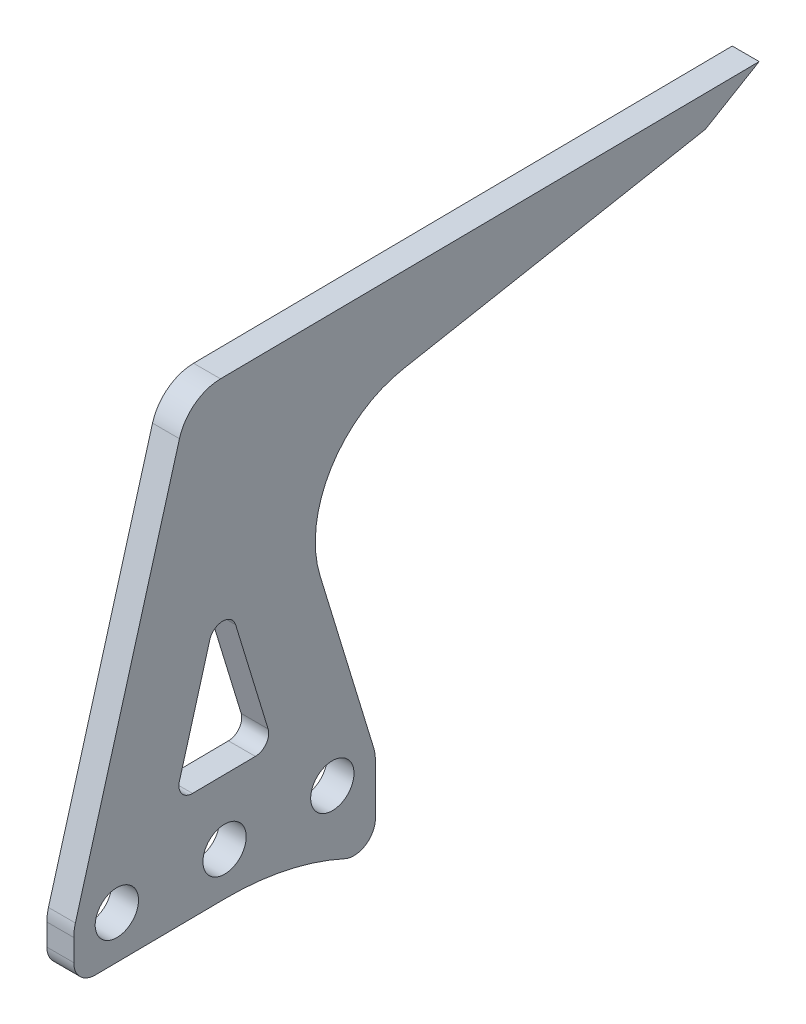
ISO-10303-21;
HEADER;
FILE_DESCRIPTION(('STEP AP214'),'2;1');
FILE_NAME('part.step','',(''),(''),'','','');
FILE_SCHEMA(('AUTOMOTIVE_DESIGN { 1 0 10303 214 1 1 1 1 }'));
ENDSEC;
DATA;
#1=APPLICATION_CONTEXT('core data for automotive mechanical design processes');
#2=APPLICATION_PROTOCOL_DEFINITION('international standard','automotive_design',2000,#1);
#3=PRODUCT_CONTEXT('',#1,'mechanical');
#4=PRODUCT('Part','Part','',(#3));
#5=PRODUCT_RELATED_PRODUCT_CATEGORY('part','',(#4));
#6=PRODUCT_DEFINITION_FORMATION('','',#4);
#7=PRODUCT_DEFINITION_CONTEXT('part definition',#1,'design');
#8=PRODUCT_DEFINITION('design','',#6,#7);
#9=PRODUCT_DEFINITION_SHAPE('','',#8);
#10=(LENGTH_UNIT() NAMED_UNIT(*) SI_UNIT(.MILLI.,.METRE.));
#11=(NAMED_UNIT(*) PLANE_ANGLE_UNIT() SI_UNIT($,.RADIAN.));
#12=(NAMED_UNIT(*) SI_UNIT($,.STERADIAN.) SOLID_ANGLE_UNIT());
#13=UNCERTAINTY_MEASURE_WITH_UNIT(LENGTH_MEASURE(1.E-05),#10,'distance_accuracy_value','');
#14=(GEOMETRIC_REPRESENTATION_CONTEXT(3) GLOBAL_UNCERTAINTY_ASSIGNED_CONTEXT((#13)) GLOBAL_UNIT_ASSIGNED_CONTEXT((#10,
#11,#12)) REPRESENTATION_CONTEXT('',''));
#15=CARTESIAN_POINT('',(0.,0.,0.));
#16=DIRECTION('',(0.,0.,1.));
#17=DIRECTION('',(1.,0.,0.));
#18=AXIS2_PLACEMENT_3D('',#15,#16,#17);
#19=CARTESIAN_POINT('',(0.431800000000018,0.,-221.533693244064));
#20=DIRECTION('',(1.,0.,0.));
#21=DIRECTION('',(0.,0.,-1.));
#22=AXIS2_PLACEMENT_3D('',#19,#20,#21);
#23=PLANE('',#22);
#24=CARTESIAN_POINT('',(0.431800000000018,0.,-221.533693244064));
#25=DIRECTION('',(-1.,0.,0.));
#26=DIRECTION('',(0.,0.,-1.));
#27=AXIS2_PLACEMENT_3D('',#24,#25,#26);
#28=CIRCLE('',#27,33.3375);
#29=CARTESIAN_POINT('',(0.431800000000018,33.3358222860145,-221.199240309772));
#30=VERTEX_POINT('',#29);
#31=CARTESIAN_POINT('',(0.431800000000018,30.3458070254473,-235.336624172831));
#32=VERTEX_POINT('',#31);
#33=EDGE_CURVE('E245',#30,#32,#28,.T.);
#34=ORIENTED_EDGE('',*,*,#33,.T.);
#35=CARTESIAN_POINT('',(0.431800000000018,32.6578685131004,-236.388276053118));
#36=DIRECTION('',(1.,0.,0.));
#37=DIRECTION('',(0.,0.,-1.));
#38=AXIS2_PLACEMENT_3D('',#35,#36,#37);
#39=CIRCLE('',#38,2.54);
#40=CARTESIAN_POINT('',(0.431800000000018,32.6578685131004,-238.928276053118));
#41=VERTEX_POINT('',#40);
#42=EDGE_CURVE('E340',#32,#41,#39,.T.);
#43=ORIENTED_EDGE('',*,*,#42,.T.);
#44=DIRECTION('',(0.,1.,0.));
#45=VECTOR('',#44,1.);
#46=CARTESIAN_POINT('',(0.431800000000018,28.439715103161,-238.928276053118));
#47=LINE('',#46,#45);
#48=CARTESIAN_POINT('',(0.431800000000018,38.5429836882743,-238.928276053118));
#49=VERTEX_POINT('',#48);
#50=EDGE_CURVE('E247',#41,#49,#47,.T.);
#51=ORIENTED_EDGE('',*,*,#50,.T.);
#52=CARTESIAN_POINT('',(0.431800000000018,38.5429836882743,-233.848276053118));
#53=DIRECTION('',(1.,0.,0.));
#54=DIRECTION('',(0.,0.,-1.));
#55=AXIS2_PLACEMENT_3D('',#52,#53,#54);
#56=CIRCLE('',#55,5.07999999999996);
#57=CARTESIAN_POINT('',(0.431800000000018,40.0252760241459,-238.707206946948));
#58=VERTEX_POINT('',#57);
#59=EDGE_CURVE('E250',#49,#58,#56,.T.);
#60=ORIENTED_EDGE('',*,*,#59,.T.);
#61=DIRECTION('',(0.,0.956482459415364,0.291789829896));
#62=VECTOR('',#61,1.);
#63=CARTESIAN_POINT('',(0.431800000000018,40.0252760241459,-238.707206946948));
#64=LINE('',#63,#62);
#65=CARTESIAN_POINT('',(0.431800000000018,60.7216548945699,-232.393455125764));
#66=VERTEX_POINT('',#65);
#67=EDGE_CURVE('E252',#58,#66,#64,.T.);
#68=ORIENTED_EDGE('',*,*,#67,.T.);
#69=CARTESIAN_POINT('',(0.431800000000018,64.4273857342491,-244.540782360339));
#70=DIRECTION('',(1.,0.,0.));
#71=DIRECTION('',(0.,0.,-1.));
#72=AXIS2_PLACEMENT_3D('',#69,#70,#71);
#73=CIRCLE('',#72,12.7);
#74=CARTESIAN_POINT('',(0.431800000000018,76.9116901524393,-242.21008649988));
#75=VERTEX_POINT('',#74);
#76=EDGE_CURVE('E45',#66,#75,#73,.F.);
#77=ORIENTED_EDGE('',*,*,#76,.T.);
#78=DIRECTION('',(0.,0.183519359091217,-0.983016095920483));
#79=VECTOR('',#78,1.);
#80=CARTESIAN_POINT('',(0.431800000000018,74.3053917711957,-228.249525215114));
#81=LINE('',#80,#79);
#82=CARTESIAN_POINT('',(0.431800000000018,83.5586093955427,-277.814115614905));
#83=VERTEX_POINT('',#82);
#84=EDGE_CURVE('E177',#75,#83,#81,.T.);
#85=ORIENTED_EDGE('',*,*,#84,.T.);
#86=DIRECTION('',(0.,0.50866309352754,-0.860965653950838));
#87=VECTOR('',#86,1.);
#88=CARTESIAN_POINT('',(0.431800000000018,83.5586093955427,-277.814115614905));
#89=LINE('',#88,#87);
#90=CARTESIAN_POINT('',(0.431800000000018,87.3102232132111,-284.164115614905));
#91=VERTEX_POINT('',#90);
#92=EDGE_CURVE('E183',#83,#91,#89,.T.);
#93=ORIENTED_EDGE('',*,*,#92,.T.);
#94=DIRECTION('',(0.,-0.0100323339870088,0.999949674871077));
#95=VECTOR('',#94,1.);
#96=CARTESIAN_POINT('',(0.431800000000018,86.6731379436378,-220.664115614905));
#97=LINE('',#96,#95);
#98=CARTESIAN_POINT('',(0.431800000000018,86.6731379436378,-220.664115614905));
#99=VERTEX_POINT('',#98);
#100=EDGE_CURVE('E193',#91,#99,#97,.T.);
#101=ORIENTED_EDGE('',*,*,#100,.T.);
#102=CARTESIAN_POINT('',(0.431800000000018,81.5933935952927,-220.715079871559));
#103=DIRECTION('',(1.,0.,0.));
#104=DIRECTION('',(0.,0.,1.));
#105=AXIS2_PLACEMENT_3D('',#102,#103,#104);
#106=CIRCLE('',#105,5.07999999999997);
#107=CARTESIAN_POINT('',(0.431800000000018,82.977899623707,-215.827386851607));
#108=VERTEX_POINT('',#107);
#109=EDGE_CURVE('E254',#99,#108,#106,.T.);
#110=ORIENTED_EDGE('',*,*,#109,.T.);
#111=DIRECTION('',(0.,-0.962144295266079,0.272540556774474));
#112=VECTOR('',#111,1.);
#113=CARTESIAN_POINT('',(0.431800000000018,39.6726556088592,-203.560583033166));
#114=LINE('',#113,#112);
#115=CARTESIAN_POINT('',(0.431800000000018,39.6726556088592,-203.560583033166));
#116=VERTEX_POINT('',#115);
#117=EDGE_CURVE('E256',#108,#116,#114,.T.);
#118=ORIENTED_EDGE('',*,*,#117,.T.);
#119=CARTESIAN_POINT('',(0.431800000000018,38.2881495804449,-208.448276053118));
#120=DIRECTION('',(1.,0.,0.));
#121=DIRECTION('',(0.,0.,-1.));
#122=AXIS2_PLACEMENT_3D('',#119,#120,#121);
#123=CIRCLE('',#122,5.07999999999996);
#124=CARTESIAN_POINT('',(0.431800000000018,38.2881495804449,-203.368276053118));
#125=VERTEX_POINT('',#124);
#126=EDGE_CURVE('E258',#116,#125,#123,.T.);
#127=ORIENTED_EDGE('',*,*,#126,.T.);
#128=DIRECTION('',(0.,-1.,0.));
#129=VECTOR('',#128,1.);
#130=CARTESIAN_POINT('',(0.431800000000018,38.2881495804449,-203.368276053118));
#131=LINE('',#130,#129);
#132=CARTESIAN_POINT('',(0.431800000000018,35.7225383374014,-203.368276053118));
#133=VERTEX_POINT('',#132);
#134=EDGE_CURVE('E260',#125,#133,#131,.T.);
#135=ORIENTED_EDGE('',*,*,#134,.T.);
#136=CARTESIAN_POINT('',(0.431800000000018,35.7225383374014,-205.908276053118));
#137=DIRECTION('',(1.,0.,0.));
#138=DIRECTION('',(0.,0.,-1.));
#139=AXIS2_PLACEMENT_3D('',#136,#137,#138);
#140=CIRCLE('',#139,2.54);
#141=CARTESIAN_POINT('',(0.431800000000018,33.1826661632288,-205.933758181445));
#142=VERTEX_POINT('',#141);
#143=EDGE_CURVE('E338',#133,#142,#140,.T.);
#144=ORIENTED_EDGE('',*,*,#143,.T.);
#145=DIRECTION('',(0.,0.0100323339870087,-0.999949674871077));
#146=VECTOR('',#145,1.);
#147=CARTESIAN_POINT('',(0.431800000000018,33.1569270943578,-203.368276053118));
#148=LINE('',#147,#146);
#149=EDGE_CURVE('E263',#142,#30,#148,.T.);
#150=ORIENTED_EDGE('',*,*,#149,.T.);
#151=EDGE_LOOP('',(#34,#43,#51,#60,#68,#77,#85,#93,#101,#110,#118,#127,#135,#144,#150));
#152=FACE_BOUND('',#151,.T.);
#153=DIRECTION('',(0.,0.010032333987009,-0.999949674871077));
#154=VECTOR('',#153,1.);
#155=CARTESIAN_POINT('',(0.431800000000018,46.0936321436847,-226.897597174519));
#156=LINE('',#155,#154);
#157=CARTESIAN_POINT('',(0.431800000000018,45.9980195865283,-217.367636791828));
#158=VERTEX_POINT('',#157);
#159=CARTESIAN_POINT('',(0.431800000000018,46.0723467272261,-224.776022544445));
#160=VERTEX_POINT('',#159);
#161=EDGE_CURVE('E207',#158,#160,#156,.T.);
#162=ORIENTED_EDGE('',*,*,#161,.F.);
#163=CARTESIAN_POINT('',(0.431800000000018,47.5854396953861,-217.351710461624));
#164=DIRECTION('',(1.,0.,0.));
#165=DIRECTION('',(0.,0.,-1.));
#166=AXIS2_PLACEMENT_3D('',#163,#164,#165);
#167=CIRCLE('',#166,1.5875);
#168=CARTESIAN_POINT('',(0.431800000000018,48.0180978292656,-215.824306392889));
#169=VERTEX_POINT('',#168);
#170=EDGE_CURVE('E325',#158,#169,#167,.F.);
#171=ORIENTED_EDGE('',*,*,#170,.T.);
#172=DIRECTION('',(0.,-0.962144295266079,0.272540556774474));
#173=VECTOR('',#172,1.);
#174=CARTESIAN_POINT('',(0.431800000000018,45.9767341700697,-215.246062161755));
#175=LINE('',#174,#173);
#176=CARTESIAN_POINT('',(0.431800000000018,60.6488833715173,-219.4021494889));
#177=VERTEX_POINT('',#176);
#178=EDGE_CURVE('E213',#177,#169,#175,.T.);
#179=ORIENTED_EDGE('',*,*,#178,.F.);
#180=CARTESIAN_POINT('',(0.431800000000018,60.2162252376379,-220.929553557635));
#181=DIRECTION('',(1.,0.,0.));
#182=DIRECTION('',(0.,0.,-1.));
#183=AXIS2_PLACEMENT_3D('',#180,#181,#182);
#184=CIRCLE('',#183,1.5875);
#185=CARTESIAN_POINT('',(0.431800000000018,60.6794415925978,-222.447969461957));
#186=VERTEX_POINT('',#185);
#187=EDGE_CURVE('E321',#177,#186,#184,.F.);
#188=ORIENTED_EDGE('',*,*,#187,.T.);
#189=DIRECTION('',(0.,0.956482459415364,0.291789829896));
#190=VECTOR('',#189,1.);
#191=CARTESIAN_POINT('',(0.431800000000018,65.8417958580733,-220.873113113931));
#192=LINE('',#191,#190);
#193=CARTESIAN_POINT('',(0.431800000000018,48.1229831910438,-226.278512118563));
#194=VERTEX_POINT('',#193);
#195=EDGE_CURVE('E222',#194,#186,#192,.T.);
#196=ORIENTED_EDGE('',*,*,#195,.F.);
#197=CARTESIAN_POINT('',(0.431800000000018,47.6597668360839,-224.760096214241));
#198=DIRECTION('',(1.,0.,0.));
#199=DIRECTION('',(0.,0.,-1.));
#200=AXIS2_PLACEMENT_3D('',#197,#198,#199);
#201=CIRCLE('',#200,1.5875);
#202=EDGE_CURVE('E317',#194,#160,#201,.F.);
#203=ORIENTED_EDGE('',*,*,#202,.T.);
#204=EDGE_LOOP('',(#162,#171,#179,#188,#196,#203));
#205=FACE_BOUND('',#204,.T.);
#206=CARTESIAN_POINT('',(0.431800000000018,38.4155666343596,-221.148276053118));
#207=DIRECTION('',(1.,0.,0.));
#208=DIRECTION('',(0.,0.,-1.));
#209=AXIS2_PLACEMENT_3D('',#206,#207,#208);
#210=CIRCLE('',#209,2.55269999999998);
#211=CARTESIAN_POINT('',(0.431800000000018,38.4155666343596,-223.700976053118));
#212=VERTEX_POINT('',#211);
#213=EDGE_CURVE('E233',#212,#212,#210,.T.);
#214=ORIENTED_EDGE('',*,*,#213,.F.);
#215=EDGE_LOOP('',(#214));
#216=FACE_BOUND('',#215,.T.);
#217=CARTESIAN_POINT('',(0.431800000000018,38.2881495804449,-208.448276053118));
#218=DIRECTION('',(1.,0.,0.));
#219=DIRECTION('',(0.,0.,-1.));
#220=AXIS2_PLACEMENT_3D('',#217,#218,#219);
#221=CIRCLE('',#220,2.55269999999998);
#222=CARTESIAN_POINT('',(0.431800000000018,38.2881495804449,-211.000976053118));
#223=VERTEX_POINT('',#222);
#224=EDGE_CURVE('E239',#223,#223,#221,.T.);
#225=ORIENTED_EDGE('',*,*,#224,.F.);
#226=EDGE_LOOP('',(#225));
#227=FACE_BOUND('',#226,.T.);
#228=CARTESIAN_POINT('',(0.431800000000018,38.5429836882743,-233.848276053118));
#229=DIRECTION('',(1.,0.,0.));
#230=DIRECTION('',(0.,0.,-1.));
#231=AXIS2_PLACEMENT_3D('',#228,#229,#230);
#232=CIRCLE('',#231,2.55269999999998);
#233=CARTESIAN_POINT('',(0.431800000000018,38.5429836882743,-236.400976053118));
#234=VERTEX_POINT('',#233);
#235=EDGE_CURVE('E227',#234,#234,#232,.T.);
#236=ORIENTED_EDGE('',*,*,#235,.F.);
#237=EDGE_LOOP('',(#236));
#238=FACE_BOUND('',#237,.T.);
#239=ADVANCED_FACE('F37',(#152,#205,#216,#227,#238),#23,.T.);
#240=CARTESIAN_POINT('',(-2.74319999999998,0.,-221.533693244064));
#241=DIRECTION('',(1.,0.,0.));
#242=DIRECTION('',(0.,0.,-1.));
#243=AXIS2_PLACEMENT_3D('',#240,#241,#242);
#244=PLANE('',#243);
#245=DIRECTION('',(0.,0.956482459415364,0.291789829896));
#246=VECTOR('',#245,1.);
#247=CARTESIAN_POINT('',(-2.74319999999998,65.8417958580733,-220.873113113931));
#248=LINE('',#247,#246);
#249=CARTESIAN_POINT('',(-2.74319999999998,48.1229831910438,-226.278512118563));
#250=VERTEX_POINT('',#249);
#251=CARTESIAN_POINT('',(-2.74319999999998,60.6794415925978,-222.447969461957));
#252=VERTEX_POINT('',#251);
#253=EDGE_CURVE('E212',#250,#252,#248,.T.);
#254=ORIENTED_EDGE('',*,*,#253,.T.);
#255=CARTESIAN_POINT('',(-2.74319999999998,60.2162252376379,-220.929553557635));
#256=DIRECTION('',(1.,0.,0.));
#257=DIRECTION('',(0.,0.,-1.));
#258=AXIS2_PLACEMENT_3D('',#255,#256,#257);
#259=CIRCLE('',#258,1.5875);
#260=CARTESIAN_POINT('',(-2.74319999999998,60.6488833715173,-219.4021494889));
#261=VERTEX_POINT('',#260);
#262=EDGE_CURVE('E323',#252,#261,#259,.T.);
#263=ORIENTED_EDGE('',*,*,#262,.T.);
#264=DIRECTION('',(0.,-0.962144295266079,0.272540556774474));
#265=VECTOR('',#264,1.);
#266=CARTESIAN_POINT('',(-2.74319999999998,45.9767341700697,-215.246062161755));
#267=LINE('',#266,#265);
#268=CARTESIAN_POINT('',(-2.74319999999998,48.0180978292656,-215.824306392889));
#269=VERTEX_POINT('',#268);
#270=EDGE_CURVE('E216',#261,#269,#267,.T.);
#271=ORIENTED_EDGE('',*,*,#270,.T.);
#272=CARTESIAN_POINT('',(-2.74319999999998,47.5854396953861,-217.351710461624));
#273=DIRECTION('',(1.,0.,0.));
#274=DIRECTION('',(0.,0.,-1.));
#275=AXIS2_PLACEMENT_3D('',#272,#273,#274);
#276=CIRCLE('',#275,1.5875);
#277=CARTESIAN_POINT('',(-2.74319999999998,45.9980195865283,-217.367636791828));
#278=VERTEX_POINT('',#277);
#279=EDGE_CURVE('E327',#269,#278,#276,.T.);
#280=ORIENTED_EDGE('',*,*,#279,.T.);
#281=DIRECTION('',(0.,0.010032333987009,-0.999949674871077));
#282=VECTOR('',#281,1.);
#283=CARTESIAN_POINT('',(-2.74319999999998,46.0936321436847,-226.897597174519));
#284=LINE('',#283,#282);
#285=CARTESIAN_POINT('',(-2.74319999999998,46.0723467272261,-224.776022544445));
#286=VERTEX_POINT('',#285);
#287=EDGE_CURVE('E209',#278,#286,#284,.T.);
#288=ORIENTED_EDGE('',*,*,#287,.T.);
#289=CARTESIAN_POINT('',(-2.74319999999998,47.6597668360839,-224.760096214241));
#290=DIRECTION('',(1.,0.,0.));
#291=DIRECTION('',(0.,0.,-1.));
#292=AXIS2_PLACEMENT_3D('',#289,#290,#291);
#293=CIRCLE('',#292,1.5875);
#294=EDGE_CURVE('E319',#286,#250,#293,.T.);
#295=ORIENTED_EDGE('',*,*,#294,.T.);
#296=EDGE_LOOP('',(#254,#263,#271,#280,#288,#295));
#297=FACE_BOUND('',#296,.T.);
#298=DIRECTION('',(0.,1.,0.));
#299=VECTOR('',#298,1.);
#300=CARTESIAN_POINT('',(-2.74319999999998,28.439715103161,-238.928276053118));
#301=LINE('',#300,#299);
#302=CARTESIAN_POINT('',(-2.74319999999998,32.6578685131004,-238.928276053118));
#303=VERTEX_POINT('',#302);
#304=CARTESIAN_POINT('',(-2.74319999999998,38.5429836882743,-238.928276053118));
#305=VERTEX_POINT('',#304);
#306=EDGE_CURVE('E268',#303,#305,#301,.T.);
#307=ORIENTED_EDGE('',*,*,#306,.F.);
#308=CARTESIAN_POINT('',(-2.74319999999998,32.6578685131004,-236.388276053118));
#309=DIRECTION('',(1.,0.,0.));
#310=DIRECTION('',(0.,0.,-1.));
#311=AXIS2_PLACEMENT_3D('',#308,#309,#310);
#312=CIRCLE('',#311,2.54);
#313=CARTESIAN_POINT('',(-2.74319999999998,30.3458070254473,-235.336624172831));
#314=VERTEX_POINT('',#313);
#315=EDGE_CURVE('E334',#303,#314,#312,.F.);
#316=ORIENTED_EDGE('',*,*,#315,.T.);
#317=CARTESIAN_POINT('',(-2.74319999999998,0.,-221.533693244064));
#318=DIRECTION('',(-1.,0.,0.));
#319=DIRECTION('',(0.,0.,-1.));
#320=AXIS2_PLACEMENT_3D('',#317,#318,#319);
#321=CIRCLE('',#320,33.3375);
#322=CARTESIAN_POINT('',(-2.74319999999998,33.3358222860145,-221.199240309772));
#323=VERTEX_POINT('',#322);
#324=EDGE_CURVE('E242',#323,#314,#321,.T.);
#325=ORIENTED_EDGE('',*,*,#324,.F.);
#326=DIRECTION('',(0.,0.0100323339870087,-0.999949674871077));
#327=VECTOR('',#326,1.);
#328=CARTESIAN_POINT('',(-2.74319999999998,33.1569270943578,-203.368276053118));
#329=LINE('',#328,#327);
#330=CARTESIAN_POINT('',(-2.74319999999998,33.1826661632288,-205.933758181445));
#331=VERTEX_POINT('',#330);
#332=EDGE_CURVE('E248',#331,#323,#329,.T.);
#333=ORIENTED_EDGE('',*,*,#332,.F.);
#334=CARTESIAN_POINT('',(-2.74319999999998,35.7225383374014,-205.908276053118));
#335=DIRECTION('',(1.,0.,0.));
#336=DIRECTION('',(0.,0.,-1.));
#337=AXIS2_PLACEMENT_3D('',#334,#335,#336);
#338=CIRCLE('',#337,2.54);
#339=CARTESIAN_POINT('',(-2.74319999999998,35.7225383374014,-203.368276053118));
#340=VERTEX_POINT('',#339);
#341=EDGE_CURVE('E332',#331,#340,#338,.F.);
#342=ORIENTED_EDGE('',*,*,#341,.T.);
#343=DIRECTION('',(0.,-1.,0.));
#344=VECTOR('',#343,1.);
#345=CARTESIAN_POINT('',(-2.74319999999998,38.2881495804449,-203.368276053118));
#346=LINE('',#345,#344);
#347=CARTESIAN_POINT('',(-2.74319999999998,38.2881495804449,-203.368276053118));
#348=VERTEX_POINT('',#347);
#349=EDGE_CURVE('E281',#348,#340,#346,.T.);
#350=ORIENTED_EDGE('',*,*,#349,.F.);
#351=CARTESIAN_POINT('',(-2.74319999999998,38.2881495804449,-208.448276053118));
#352=DIRECTION('',(1.,0.,0.));
#353=DIRECTION('',(0.,0.,-1.));
#354=AXIS2_PLACEMENT_3D('',#351,#352,#353);
#355=CIRCLE('',#354,5.07999999999996);
#356=CARTESIAN_POINT('',(-2.74319999999998,39.6726556088592,-203.560583033166));
#357=VERTEX_POINT('',#356);
#358=EDGE_CURVE('E279',#357,#348,#355,.T.);
#359=ORIENTED_EDGE('',*,*,#358,.F.);
#360=DIRECTION('',(0.,-0.962144295266079,0.272540556774474));
#361=VECTOR('',#360,1.);
#362=CARTESIAN_POINT('',(-2.74319999999998,39.6726556088592,-203.560583033166));
#363=LINE('',#362,#361);
#364=CARTESIAN_POINT('',(-2.74319999999998,82.977899623707,-215.827386851607));
#365=VERTEX_POINT('',#364);
#366=EDGE_CURVE('E277',#365,#357,#363,.T.);
#367=ORIENTED_EDGE('',*,*,#366,.F.);
#368=CARTESIAN_POINT('',(-2.74319999999998,81.5933935952927,-220.715079871559));
#369=DIRECTION('',(1.,0.,0.));
#370=DIRECTION('',(0.,0.,1.));
#371=AXIS2_PLACEMENT_3D('',#368,#369,#370);
#372=CIRCLE('',#371,5.07999999999997);
#373=CARTESIAN_POINT('',(-2.74319999999999,86.6731379436378,-220.664115614905));
#374=VERTEX_POINT('',#373);
#375=EDGE_CURVE('E275',#374,#365,#372,.T.);
#376=ORIENTED_EDGE('',*,*,#375,.F.);
#377=DIRECTION('',(0.,0.0100323339870088,-0.999949674871077));
#378=VECTOR('',#377,1.);
#379=CARTESIAN_POINT('',(-2.74319999999999,86.6731379436378,-220.664115614905));
#380=LINE('',#379,#378);
#381=CARTESIAN_POINT('',(-2.74319999999999,87.3102232132111,-284.164115614905));
#382=VERTEX_POINT('',#381);
#383=EDGE_CURVE('E208',#374,#382,#380,.T.);
#384=ORIENTED_EDGE('',*,*,#383,.T.);
#385=DIRECTION('',(0.,-0.50866309352754,0.860965653950838));
#386=VECTOR('',#385,1.);
#387=CARTESIAN_POINT('',(-2.74319999999999,83.5586093955427,-277.814115614905));
#388=LINE('',#387,#386);
#389=CARTESIAN_POINT('',(-2.74319999999999,83.5586093955427,-277.814115614905));
#390=VERTEX_POINT('',#389);
#391=EDGE_CURVE('E204',#382,#390,#388,.T.);
#392=ORIENTED_EDGE('',*,*,#391,.T.);
#393=DIRECTION('',(0.,-0.183519359091217,0.983016095920483));
#394=VECTOR('',#393,1.);
#395=CARTESIAN_POINT('',(-2.74319999999999,74.3053917711957,-228.249525215114));
#396=LINE('',#395,#394);
#397=CARTESIAN_POINT('',(-2.74319999999999,76.9116901524393,-242.21008649988));
#398=VERTEX_POINT('',#397);
#399=EDGE_CURVE('E189',#390,#398,#396,.T.);
#400=ORIENTED_EDGE('',*,*,#399,.T.);
#401=CARTESIAN_POINT('',(-2.74319999999998,64.4273857342491,-244.540782360339));
#402=DIRECTION('',(1.,0.,0.));
#403=DIRECTION('',(0.,0.,-1.));
#404=AXIS2_PLACEMENT_3D('',#401,#402,#403);
#405=CIRCLE('',#404,12.7);
#406=CARTESIAN_POINT('',(-2.74319999999998,60.7216548945699,-232.393455125764));
#407=VERTEX_POINT('',#406);
#408=EDGE_CURVE('E11',#398,#407,#405,.T.);
#409=ORIENTED_EDGE('',*,*,#408,.T.);
#410=DIRECTION('',(0.,0.956482459415364,0.291789829896));
#411=VECTOR('',#410,1.);
#412=CARTESIAN_POINT('',(-2.74319999999998,40.0252760241459,-238.707206946948));
#413=LINE('',#412,#411);
#414=CARTESIAN_POINT('',(-2.74319999999998,40.0252760241459,-238.707206946948));
#415=VERTEX_POINT('',#414);
#416=EDGE_CURVE('E272',#415,#407,#413,.T.);
#417=ORIENTED_EDGE('',*,*,#416,.F.);
#418=CARTESIAN_POINT('',(-2.74319999999998,38.5429836882743,-233.848276053118));
#419=DIRECTION('',(1.,0.,0.));
#420=DIRECTION('',(0.,0.,-1.));
#421=AXIS2_PLACEMENT_3D('',#418,#419,#420);
#422=CIRCLE('',#421,5.07999999999996);
#423=EDGE_CURVE('E270',#305,#415,#422,.T.);
#424=ORIENTED_EDGE('',*,*,#423,.F.);
#425=EDGE_LOOP('',(#307,#316,#325,#333,#342,#350,#359,#367,#376,#384,#392,#400,#409,#417,#424));
#426=FACE_BOUND('',#425,.T.);
#427=CARTESIAN_POINT('',(-2.74319999999998,38.2881495804449,-208.448276053118));
#428=DIRECTION('',(1.,0.,0.));
#429=DIRECTION('',(0.,0.,-1.));
#430=AXIS2_PLACEMENT_3D('',#427,#428,#429);
#431=CIRCLE('',#430,2.55269999999998);
#432=CARTESIAN_POINT('',(-2.74319999999998,38.2881495804449,-211.000976053118));
#433=VERTEX_POINT('',#432);
#434=EDGE_CURVE('E236',#433,#433,#431,.T.);
#435=ORIENTED_EDGE('',*,*,#434,.T.);
#436=EDGE_LOOP('',(#435));
#437=FACE_BOUND('',#436,.T.);
#438=CARTESIAN_POINT('',(-2.74319999999998,38.4155666343596,-221.148276053118));
#439=DIRECTION('',(1.,0.,0.));
#440=DIRECTION('',(0.,0.,-1.));
#441=AXIS2_PLACEMENT_3D('',#438,#439,#440);
#442=CIRCLE('',#441,2.55269999999998);
#443=CARTESIAN_POINT('',(-2.74319999999998,38.4155666343596,-223.700976053118));
#444=VERTEX_POINT('',#443);
#445=EDGE_CURVE('E230',#444,#444,#442,.T.);
#446=ORIENTED_EDGE('',*,*,#445,.T.);
#447=EDGE_LOOP('',(#446));
#448=FACE_BOUND('',#447,.T.);
#449=CARTESIAN_POINT('',(-2.74319999999998,38.5429836882743,-233.848276053118));
#450=DIRECTION('',(1.,0.,0.));
#451=DIRECTION('',(0.,0.,-1.));
#452=AXIS2_PLACEMENT_3D('',#449,#450,#451);
#453=CIRCLE('',#452,2.55269999999998);
#454=CARTESIAN_POINT('',(-2.74319999999998,38.5429836882743,-236.400976053118));
#455=VERTEX_POINT('',#454);
#456=EDGE_CURVE('E219',#455,#455,#453,.T.);
#457=ORIENTED_EDGE('',*,*,#456,.T.);
#458=EDGE_LOOP('',(#457));
#459=FACE_BOUND('',#458,.T.);
#460=ADVANCED_FACE('F366',(#297,#426,#437,#448,#459),#244,.F.);
#461=CARTESIAN_POINT('',(0.431800000000018,0.,-221.533693244064));
#462=DIRECTION('',(-1.,0.,0.));
#463=DIRECTION('',(0.,0.,1.));
#464=AXIS2_PLACEMENT_3D('',#461,#462,#463);
#465=CYLINDRICAL_SURFACE('',#464,33.3375);
#466=ORIENTED_EDGE('',*,*,#324,.T.);
#467=DIRECTION('',(-1.,0.,0.));
#468=VECTOR('',#467,1.);
#469=CARTESIAN_POINT('',(0.431800000000018,30.3458070254473,-235.336624172831));
#470=LINE('',#469,#468);
#471=EDGE_CURVE('E336',#314,#32,#470,.F.);
#472=ORIENTED_EDGE('',*,*,#471,.T.);
#473=ORIENTED_EDGE('',*,*,#33,.F.);
#474=DIRECTION('',(-1.,0.,0.));
#475=VECTOR('',#474,1.);
#476=CARTESIAN_POINT('',(0.431800000000018,33.3358222860145,-221.199240309772));
#477=LINE('',#476,#475);
#478=EDGE_CURVE('E265',#30,#323,#477,.T.);
#479=ORIENTED_EDGE('',*,*,#478,.T.);
#480=EDGE_LOOP('',(#466,#472,#473,#479));
#481=FACE_BOUND('',#480,.T.);
#482=ADVANCED_FACE('F380',(#481),#465,.F.);
#483=CARTESIAN_POINT('',(0.431800000000018,28.439715103161,-238.928276053118));
#484=DIRECTION('',(0.,0.,1.));
#485=DIRECTION('',(1.,0.,0.));
#486=AXIS2_PLACEMENT_3D('',#483,#484,#485);
#487=PLANE('',#486);
#488=ORIENTED_EDGE('',*,*,#50,.F.);
#489=DIRECTION('',(-1.,0.,0.));
#490=VECTOR('',#489,1.);
#491=CARTESIAN_POINT('',(0.431800000000018,32.6578685131004,-238.928276053118));
#492=LINE('',#491,#490);
#493=EDGE_CURVE('E329',#41,#303,#492,.T.);
#494=ORIENTED_EDGE('',*,*,#493,.T.);
#495=ORIENTED_EDGE('',*,*,#306,.T.);
#496=DIRECTION('',(-1.,0.,0.));
#497=VECTOR('',#496,1.);
#498=CARTESIAN_POINT('',(0.431800000000018,38.5429836882743,-238.928276053118));
#499=LINE('',#498,#497);
#500=EDGE_CURVE('E299',#49,#305,#499,.T.);
#501=ORIENTED_EDGE('',*,*,#500,.F.);
#502=EDGE_LOOP('',(#488,#494,#495,#501));
#503=FACE_BOUND('',#502,.T.);
#504=ADVANCED_FACE('F411',(#503),#487,.F.);
#505=CARTESIAN_POINT('',(0.431800000000018,38.5429836882743,-233.848276053118));
#506=DIRECTION('',(-1.,0.,0.));
#507=DIRECTION('',(0.,0.,1.));
#508=AXIS2_PLACEMENT_3D('',#505,#506,#507);
#509=CYLINDRICAL_SURFACE('',#508,5.07999999999996);
#510=ORIENTED_EDGE('',*,*,#423,.T.);
#511=DIRECTION('',(-1.,0.,0.));
#512=VECTOR('',#511,1.);
#513=CARTESIAN_POINT('',(0.431800000000018,40.0252760241459,-238.707206946948));
#514=LINE('',#513,#512);
#515=EDGE_CURVE('E296',#58,#415,#514,.T.);
#516=ORIENTED_EDGE('',*,*,#515,.F.);
#517=ORIENTED_EDGE('',*,*,#59,.F.);
#518=ORIENTED_EDGE('',*,*,#500,.T.);
#519=EDGE_LOOP('',(#510,#516,#517,#518));
#520=FACE_BOUND('',#519,.T.);
#521=ADVANCED_FACE('F362',(#520),#509,.T.);
#522=CARTESIAN_POINT('',(0.431800000000018,40.0252760241459,-238.707206946948));
#523=DIRECTION('',(0.,-0.291789829896,0.956482459415364));
#524=DIRECTION('',(0.,-0.956482459415364,-0.291789829896));
#525=AXIS2_PLACEMENT_3D('',#522,#523,#524);
#526=PLANE('',#525);
#527=ORIENTED_EDGE('',*,*,#416,.T.);
#528=DIRECTION('',(1.,0.,0.));
#529=VECTOR('',#528,1.);
#530=CARTESIAN_POINT('',(0.431800000000018,60.7216548945699,-232.393455125764));
#531=LINE('',#530,#529);
#532=EDGE_CURVE('E347',#407,#66,#531,.T.);
#533=ORIENTED_EDGE('',*,*,#532,.T.);
#534=ORIENTED_EDGE('',*,*,#67,.F.);
#535=ORIENTED_EDGE('',*,*,#515,.T.);
#536=EDGE_LOOP('',(#527,#533,#534,#535));
#537=FACE_BOUND('',#536,.T.);
#538=ADVANCED_FACE('F353',(#537),#526,.F.);
#539=CARTESIAN_POINT('',(0.431800000000018,81.5933935952927,-220.715079871559));
#540=DIRECTION('',(-1.,0.,0.));
#541=DIRECTION('',(0.,0.,1.));
#542=AXIS2_PLACEMENT_3D('',#539,#540,#541);
#543=CYLINDRICAL_SURFACE('',#542,5.07999999999997);
#544=ORIENTED_EDGE('',*,*,#109,.F.);
#545=DIRECTION('',(1.,0.,0.));
#546=VECTOR('',#545,1.);
#547=CARTESIAN_POINT('',(-67.5612194146291,86.6731379436378,-220.664115614905));
#548=LINE('',#547,#546);
#549=EDGE_CURVE('E201',#374,#99,#548,.T.);
#550=ORIENTED_EDGE('',*,*,#549,.F.);
#551=ORIENTED_EDGE('',*,*,#375,.T.);
#552=DIRECTION('',(-1.,0.,0.));
#553=VECTOR('',#552,1.);
#554=CARTESIAN_POINT('',(0.431800000000018,82.977899623707,-215.827386851607));
#555=LINE('',#554,#553);
#556=EDGE_CURVE('E293',#108,#365,#555,.T.);
#557=ORIENTED_EDGE('',*,*,#556,.F.);
#558=EDGE_LOOP('',(#544,#550,#551,#557));
#559=FACE_BOUND('',#558,.T.);
#560=ADVANCED_FACE('F402',(#559),#543,.T.);
#561=CARTESIAN_POINT('',(0.431800000000018,39.6726556088592,-203.560583033166));
#562=DIRECTION('',(0.,-0.272540556774474,-0.962144295266079));
#563=DIRECTION('',(0.,0.962144295266079,-0.272540556774474));
#564=AXIS2_PLACEMENT_3D('',#561,#562,#563);
#565=PLANE('',#564);
#566=ORIENTED_EDGE('',*,*,#366,.T.);
#567=DIRECTION('',(-1.,0.,0.));
#568=VECTOR('',#567,1.);
#569=CARTESIAN_POINT('',(0.431800000000018,39.6726556088592,-203.560583033166));
#570=LINE('',#569,#568);
#571=EDGE_CURVE('E290',#116,#357,#570,.T.);
#572=ORIENTED_EDGE('',*,*,#571,.F.);
#573=ORIENTED_EDGE('',*,*,#117,.F.);
#574=ORIENTED_EDGE('',*,*,#556,.T.);
#575=EDGE_LOOP('',(#566,#572,#573,#574));
#576=FACE_BOUND('',#575,.T.);
#577=ADVANCED_FACE('F398',(#576),#565,.F.);
#578=CARTESIAN_POINT('',(0.431800000000018,38.2881495804449,-208.448276053118));
#579=DIRECTION('',(-1.,0.,0.));
#580=DIRECTION('',(0.,0.,1.));
#581=AXIS2_PLACEMENT_3D('',#578,#579,#580);
#582=CYLINDRICAL_SURFACE('',#581,5.07999999999996);
#583=ORIENTED_EDGE('',*,*,#358,.T.);
#584=DIRECTION('',(-1.,0.,0.));
#585=VECTOR('',#584,1.);
#586=CARTESIAN_POINT('',(0.431800000000018,38.2881495804449,-203.368276053118));
#587=LINE('',#586,#585);
#588=EDGE_CURVE('E287',#125,#348,#587,.T.);
#589=ORIENTED_EDGE('',*,*,#588,.F.);
#590=ORIENTED_EDGE('',*,*,#126,.F.);
#591=ORIENTED_EDGE('',*,*,#571,.T.);
#592=EDGE_LOOP('',(#583,#589,#590,#591));
#593=FACE_BOUND('',#592,.T.);
#594=ADVANCED_FACE('F394',(#593),#582,.T.);
#595=CARTESIAN_POINT('',(0.431800000000018,38.2881495804449,-203.368276053118));
#596=DIRECTION('',(0.,0.,-1.));
#597=DIRECTION('',(-1.,0.,0.));
#598=AXIS2_PLACEMENT_3D('',#595,#596,#597);
#599=PLANE('',#598);
#600=ORIENTED_EDGE('',*,*,#349,.T.);
#601=DIRECTION('',(-1.,0.,0.));
#602=VECTOR('',#601,1.);
#603=CARTESIAN_POINT('',(0.431800000000018,35.7225383374014,-203.368276053118));
#604=LINE('',#603,#602);
#605=EDGE_CURVE('E345',#340,#133,#604,.F.);
#606=ORIENTED_EDGE('',*,*,#605,.T.);
#607=ORIENTED_EDGE('',*,*,#134,.F.);
#608=ORIENTED_EDGE('',*,*,#588,.T.);
#609=EDGE_LOOP('',(#600,#606,#607,#608));
#610=FACE_BOUND('',#609,.T.);
#611=ADVANCED_FACE('F390',(#610),#599,.F.);
#612=CARTESIAN_POINT('',(0.431800000000018,33.1569270943578,-203.368276053118));
#613=DIRECTION('',(0.,0.999949674871077,0.0100323339870087));
#614=DIRECTION('',(0.,-0.0100323339870087,0.999949674871077));
#615=AXIS2_PLACEMENT_3D('',#612,#613,#614);
#616=PLANE('',#615);
#617=ORIENTED_EDGE('',*,*,#149,.F.);
#618=DIRECTION('',(-1.,0.,0.));
#619=VECTOR('',#618,1.);
#620=CARTESIAN_POINT('',(0.431800000000018,33.1826661632288,-205.933758181445));
#621=LINE('',#620,#619);
#622=EDGE_CURVE('E342',#142,#331,#621,.T.);
#623=ORIENTED_EDGE('',*,*,#622,.T.);
#624=ORIENTED_EDGE('',*,*,#332,.T.);
#625=ORIENTED_EDGE('',*,*,#478,.F.);
#626=EDGE_LOOP('',(#617,#623,#624,#625));
#627=FACE_BOUND('',#626,.T.);
#628=ADVANCED_FACE('F387',(#627),#616,.F.);
#629=CARTESIAN_POINT('',(0.431800000000018,38.2881495804449,-208.448276053118));
#630=DIRECTION('',(-1.,0.,0.));
#631=DIRECTION('',(0.,0.,1.));
#632=AXIS2_PLACEMENT_3D('',#629,#630,#631);
#633=CYLINDRICAL_SURFACE('',#632,2.55269999999998);
#634=ORIENTED_EDGE('',*,*,#224,.T.);
#635=EDGE_LOOP('',(#634));
#636=FACE_BOUND('',#635,.T.);
#637=ORIENTED_EDGE('',*,*,#434,.F.);
#638=EDGE_LOOP('',(#637));
#639=FACE_BOUND('',#638,.T.);
#640=ADVANCED_FACE('F384',(#636,#639),#633,.F.);
#641=CARTESIAN_POINT('',(0.431800000000018,38.4155666343596,-221.148276053118));
#642=DIRECTION('',(-1.,0.,0.));
#643=DIRECTION('',(0.,0.,1.));
#644=AXIS2_PLACEMENT_3D('',#641,#642,#643);
#645=CYLINDRICAL_SURFACE('',#644,2.55269999999998);
#646=ORIENTED_EDGE('',*,*,#213,.T.);
#647=EDGE_LOOP('',(#646));
#648=FACE_BOUND('',#647,.T.);
#649=ORIENTED_EDGE('',*,*,#445,.F.);
#650=EDGE_LOOP('',(#649));
#651=FACE_BOUND('',#650,.T.);
#652=ADVANCED_FACE('F482',(#648,#651),#645,.F.);
#653=CARTESIAN_POINT('',(0.431800000000018,38.5429836882743,-233.848276053118));
#654=DIRECTION('',(-1.,0.,0.));
#655=DIRECTION('',(0.,0.,1.));
#656=AXIS2_PLACEMENT_3D('',#653,#654,#655);
#657=CYLINDRICAL_SURFACE('',#656,2.55269999999998);
#658=ORIENTED_EDGE('',*,*,#235,.T.);
#659=EDGE_LOOP('',(#658));
#660=FACE_BOUND('',#659,.T.);
#661=ORIENTED_EDGE('',*,*,#456,.F.);
#662=EDGE_LOOP('',(#661));
#663=FACE_BOUND('',#662,.T.);
#664=ADVANCED_FACE('F479',(#660,#663),#657,.F.);
#665=CARTESIAN_POINT('',(-2.74319999999998,46.0936321436847,-226.897597174519));
#666=DIRECTION('',(0.,-0.999949674871077,-0.010032333987009));
#667=DIRECTION('',(0.,0.010032333987009,-0.999949674871077));
#668=AXIS2_PLACEMENT_3D('',#665,#666,#667);
#669=PLANE('',#668);
#670=ORIENTED_EDGE('',*,*,#161,.T.);
#671=DIRECTION('',(1.,0.,0.));
#672=VECTOR('',#671,1.);
#673=CARTESIAN_POINT('',(-2.74319999999998,46.0723467272261,-224.776022544445));
#674=LINE('',#673,#672);
#675=EDGE_CURVE('E310',#160,#286,#674,.F.);
#676=ORIENTED_EDGE('',*,*,#675,.T.);
#677=ORIENTED_EDGE('',*,*,#287,.F.);
#678=DIRECTION('',(1.,0.,0.));
#679=VECTOR('',#678,1.);
#680=CARTESIAN_POINT('',(0.431800000000018,45.9980195865283,-217.367636791828));
#681=LINE('',#680,#679);
#682=EDGE_CURVE('E307',#278,#158,#681,.T.);
#683=ORIENTED_EDGE('',*,*,#682,.T.);
#684=EDGE_LOOP('',(#670,#676,#677,#683));
#685=FACE_BOUND('',#684,.T.);
#686=ADVANCED_FACE('F474',(#685),#669,.F.);
#687=CARTESIAN_POINT('',(-2.74319999999998,45.9767341700697,-215.246062161755));
#688=DIRECTION('',(0.,0.272540556774474,0.962144295266079));
#689=DIRECTION('',(0.,-0.962144295266079,0.272540556774474));
#690=AXIS2_PLACEMENT_3D('',#687,#688,#689);
#691=PLANE('',#690);
#692=ORIENTED_EDGE('',*,*,#270,.F.);
#693=DIRECTION('',(1.,0.,0.));
#694=VECTOR('',#693,1.);
#695=CARTESIAN_POINT('',(0.431800000000018,60.6488833715173,-219.4021494889));
#696=LINE('',#695,#694);
#697=EDGE_CURVE('E314',#261,#177,#696,.T.);
#698=ORIENTED_EDGE('',*,*,#697,.T.);
#699=ORIENTED_EDGE('',*,*,#178,.T.);
#700=DIRECTION('',(1.,0.,0.));
#701=VECTOR('',#700,1.);
#702=CARTESIAN_POINT('',(-2.74319999999998,48.0180978292656,-215.824306392889));
#703=LINE('',#702,#701);
#704=EDGE_CURVE('E312',#169,#269,#703,.F.);
#705=ORIENTED_EDGE('',*,*,#704,.T.);
#706=EDGE_LOOP('',(#692,#698,#699,#705));
#707=FACE_BOUND('',#706,.T.);
#708=ADVANCED_FACE('F467',(#707),#691,.F.);
#709=CARTESIAN_POINT('',(-2.74319999999998,65.8417958580733,-220.873113113931));
#710=DIRECTION('',(0.,0.291789829896,-0.956482459415364));
#711=DIRECTION('',(0.,0.956482459415364,0.291789829896));
#712=AXIS2_PLACEMENT_3D('',#709,#710,#711);
#713=PLANE('',#712);
#714=ORIENTED_EDGE('',*,*,#253,.F.);
#715=DIRECTION('',(1.,0.,0.));
#716=VECTOR('',#715,1.);
#717=CARTESIAN_POINT('',(0.431800000000018,48.1229831910438,-226.278512118563));
#718=LINE('',#717,#716);
#719=EDGE_CURVE('E304',#250,#194,#718,.T.);
#720=ORIENTED_EDGE('',*,*,#719,.T.);
#721=ORIENTED_EDGE('',*,*,#195,.T.);
#722=DIRECTION('',(1.,0.,0.));
#723=VECTOR('',#722,1.);
#724=CARTESIAN_POINT('',(-2.74319999999998,60.6794415925978,-222.447969461957));
#725=LINE('',#724,#723);
#726=EDGE_CURVE('E302',#186,#252,#725,.F.);
#727=ORIENTED_EDGE('',*,*,#726,.T.);
#728=EDGE_LOOP('',(#714,#720,#721,#727));
#729=FACE_BOUND('',#728,.T.);
#730=ADVANCED_FACE('F460',(#729),#713,.F.);
#731=CARTESIAN_POINT('',(-67.5612194146291,86.6731379436378,-220.664115614905));
#732=DIRECTION('',(0.,0.999949674871077,0.0100323339870088));
#733=DIRECTION('',(0.,-0.0100323339870088,0.999949674871077));
#734=AXIS2_PLACEMENT_3D('',#731,#732,#733);
#735=PLANE('',#734);
#736=ORIENTED_EDGE('',*,*,#383,.F.);
#737=ORIENTED_EDGE('',*,*,#549,.T.);
#738=ORIENTED_EDGE('',*,*,#100,.F.);
#739=DIRECTION('',(1.,0.,0.));
#740=VECTOR('',#739,1.);
#741=CARTESIAN_POINT('',(-67.5612194146291,87.3102232132111,-284.164115614905));
#742=LINE('',#741,#740);
#743=EDGE_CURVE('E192',#382,#91,#742,.T.);
#744=ORIENTED_EDGE('',*,*,#743,.F.);
#745=EDGE_LOOP('',(#736,#737,#738,#744));
#746=FACE_BOUND('',#745,.T.);
#747=ADVANCED_FACE('F457',(#746),#735,.T.);
#748=CARTESIAN_POINT('',(-67.5612194146291,83.5586093955427,-277.814115614905));
#749=DIRECTION('',(0.,-0.860965653950838,-0.50866309352754));
#750=DIRECTION('',(0.,0.50866309352754,-0.860965653950838));
#751=AXIS2_PLACEMENT_3D('',#748,#749,#750);
#752=PLANE('',#751);
#753=ORIENTED_EDGE('',*,*,#391,.F.);
#754=ORIENTED_EDGE('',*,*,#743,.T.);
#755=ORIENTED_EDGE('',*,*,#92,.F.);
#756=DIRECTION('',(1.,0.,0.));
#757=VECTOR('',#756,1.);
#758=CARTESIAN_POINT('',(-67.5612194146291,83.5586093955427,-277.814115614905));
#759=LINE('',#758,#757);
#760=EDGE_CURVE('E187',#390,#83,#759,.T.);
#761=ORIENTED_EDGE('',*,*,#760,.F.);
#762=EDGE_LOOP('',(#753,#754,#755,#761));
#763=FACE_BOUND('',#762,.T.);
#764=ADVANCED_FACE('F195',(#763),#752,.T.);
#765=CARTESIAN_POINT('',(-67.5612194146291,74.3053917711957,-228.249525215114));
#766=DIRECTION('',(0.,-0.983016095920483,-0.183519359091217));
#767=DIRECTION('',(0.,0.183519359091217,-0.983016095920483));
#768=AXIS2_PLACEMENT_3D('',#765,#766,#767);
#769=PLANE('',#768);
#770=ORIENTED_EDGE('',*,*,#84,.F.);
#771=DIRECTION('',(1.,0.,0.));
#772=VECTOR('',#771,1.);
#773=CARTESIAN_POINT('',(-67.5612194146291,76.9116901524393,-242.21008649988));
#774=LINE('',#773,#772);
#775=EDGE_CURVE('E58',#75,#398,#774,.F.);
#776=ORIENTED_EDGE('',*,*,#775,.T.);
#777=ORIENTED_EDGE('',*,*,#399,.F.);
#778=ORIENTED_EDGE('',*,*,#760,.T.);
#779=EDGE_LOOP('',(#770,#776,#777,#778));
#780=FACE_BOUND('',#779,.T.);
#781=ADVANCED_FACE('F188',(#780),#769,.T.);
#782=CARTESIAN_POINT('',(-2.74319999999998,47.6597668360839,-224.760096214241));
#783=DIRECTION('',(-1.,0.,0.));
#784=DIRECTION('',(0.,0.,1.));
#785=AXIS2_PLACEMENT_3D('',#782,#783,#784);
#786=CYLINDRICAL_SURFACE('',#785,1.5875);
#787=ORIENTED_EDGE('',*,*,#294,.F.);
#788=ORIENTED_EDGE('',*,*,#675,.F.);
#789=ORIENTED_EDGE('',*,*,#202,.F.);
#790=ORIENTED_EDGE('',*,*,#719,.F.);
#791=EDGE_LOOP('',(#787,#788,#789,#790));
#792=FACE_BOUND('',#791,.T.);
#793=ADVANCED_FACE('F418',(#792),#786,.F.);
#794=CARTESIAN_POINT('',(-2.74319999999998,60.2162252376379,-220.929553557635));
#795=DIRECTION('',(-1.,0.,0.));
#796=DIRECTION('',(0.,0.,1.));
#797=AXIS2_PLACEMENT_3D('',#794,#795,#796);
#798=CYLINDRICAL_SURFACE('',#797,1.5875);
#799=ORIENTED_EDGE('',*,*,#262,.F.);
#800=ORIENTED_EDGE('',*,*,#726,.F.);
#801=ORIENTED_EDGE('',*,*,#187,.F.);
#802=ORIENTED_EDGE('',*,*,#697,.F.);
#803=EDGE_LOOP('',(#799,#800,#801,#802));
#804=FACE_BOUND('',#803,.T.);
#805=ADVANCED_FACE('F421',(#804),#798,.F.);
#806=CARTESIAN_POINT('',(-2.74319999999998,47.5854396953861,-217.351710461624));
#807=DIRECTION('',(-1.,0.,0.));
#808=DIRECTION('',(0.,0.,1.));
#809=AXIS2_PLACEMENT_3D('',#806,#807,#808);
#810=CYLINDRICAL_SURFACE('',#809,1.5875);
#811=ORIENTED_EDGE('',*,*,#279,.F.);
#812=ORIENTED_EDGE('',*,*,#704,.F.);
#813=ORIENTED_EDGE('',*,*,#170,.F.);
#814=ORIENTED_EDGE('',*,*,#682,.F.);
#815=EDGE_LOOP('',(#811,#812,#813,#814));
#816=FACE_BOUND('',#815,.T.);
#817=ADVANCED_FACE('F425',(#816),#810,.F.);
#818=CARTESIAN_POINT('',(0.431800000000018,32.6578685131004,-236.388276053118));
#819=DIRECTION('',(-1.,0.,0.));
#820=DIRECTION('',(0.,0.,1.));
#821=AXIS2_PLACEMENT_3D('',#818,#819,#820);
#822=CYLINDRICAL_SURFACE('',#821,2.54);
#823=ORIENTED_EDGE('',*,*,#42,.F.);
#824=ORIENTED_EDGE('',*,*,#471,.F.);
#825=ORIENTED_EDGE('',*,*,#315,.F.);
#826=ORIENTED_EDGE('',*,*,#493,.F.);
#827=EDGE_LOOP('',(#823,#824,#825,#826));
#828=FACE_BOUND('',#827,.T.);
#829=ADVANCED_FACE('F373',(#828),#822,.T.);
#830=CARTESIAN_POINT('',(0.431800000000018,35.7225383374014,-205.908276053118));
#831=DIRECTION('',(-1.,0.,0.));
#832=DIRECTION('',(0.,0.,1.));
#833=AXIS2_PLACEMENT_3D('',#830,#831,#832);
#834=CYLINDRICAL_SURFACE('',#833,2.54);
#835=ORIENTED_EDGE('',*,*,#143,.F.);
#836=ORIENTED_EDGE('',*,*,#605,.F.);
#837=ORIENTED_EDGE('',*,*,#341,.F.);
#838=ORIENTED_EDGE('',*,*,#622,.F.);
#839=EDGE_LOOP('',(#835,#836,#837,#838));
#840=FACE_BOUND('',#839,.T.);
#841=ADVANCED_FACE('F369',(#840),#834,.T.);
#842=CARTESIAN_POINT('',(0.431800000000018,64.4273857342491,-244.540782360339));
#843=DIRECTION('',(1.,0.,0.));
#844=DIRECTION('',(0.,0.,-1.));
#845=AXIS2_PLACEMENT_3D('',#842,#843,#844);
#846=CYLINDRICAL_SURFACE('',#845,12.7);
#847=ORIENTED_EDGE('',*,*,#408,.F.);
#848=ORIENTED_EDGE('',*,*,#775,.F.);
#849=ORIENTED_EDGE('',*,*,#76,.F.);
#850=ORIENTED_EDGE('',*,*,#532,.F.);
#851=EDGE_LOOP('',(#847,#848,#849,#850));
#852=FACE_BOUND('',#851,.T.);
#853=ADVANCED_FACE('F39',(#852),#846,.F.);
#854=CLOSED_SHELL('',(#239,#460,#482,#504,#521,#538,#560,#577,#594,#611,#628,#640,#652,#664,
#686,#708,#730,#747,#764,#781,#793,#805,#817,#829,#841,#853));
#855=MANIFOLD_SOLID_BREP('B2',#854);
#856=ADVANCED_BREP_SHAPE_REPRESENTATION('',(#18,#855),#14);
#857=SHAPE_DEFINITION_REPRESENTATION(#9,#856);
ENDSEC;
END-ISO-10303-21;
